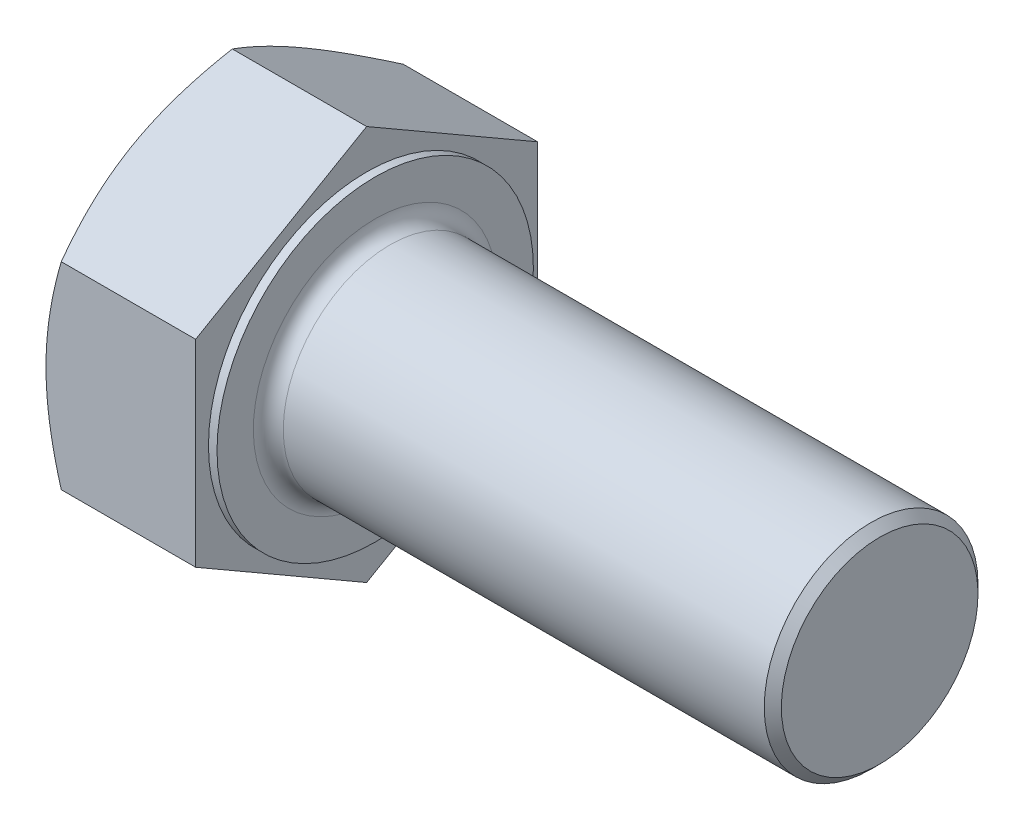
ISO-10303-21;
HEADER;
FILE_DESCRIPTION(('STEP AP214'),'2;1');
FILE_NAME('part.step','',(''),(''),'','','');
FILE_SCHEMA(('AUTOMOTIVE_DESIGN { 1 0 10303 214 1 1 1 1 }'));
ENDSEC;
DATA;
#1=APPLICATION_CONTEXT('core data for automotive mechanical design processes');
#2=APPLICATION_PROTOCOL_DEFINITION('international standard','automotive_design',2000,#1);
#3=PRODUCT_CONTEXT('',#1,'mechanical');
#4=PRODUCT('Part','Part','',(#3));
#5=PRODUCT_RELATED_PRODUCT_CATEGORY('part','',(#4));
#6=PRODUCT_DEFINITION_FORMATION('','',#4);
#7=PRODUCT_DEFINITION_CONTEXT('part definition',#1,'design');
#8=PRODUCT_DEFINITION('design','',#6,#7);
#9=PRODUCT_DEFINITION_SHAPE('','',#8);
#10=(LENGTH_UNIT() NAMED_UNIT(*) SI_UNIT(.MILLI.,.METRE.));
#11=(NAMED_UNIT(*) PLANE_ANGLE_UNIT() SI_UNIT($,.RADIAN.));
#12=(NAMED_UNIT(*) SI_UNIT($,.STERADIAN.) SOLID_ANGLE_UNIT());
#13=UNCERTAINTY_MEASURE_WITH_UNIT(LENGTH_MEASURE(1.E-05),#10,'distance_accuracy_value','');
#14=(GEOMETRIC_REPRESENTATION_CONTEXT(3) GLOBAL_UNCERTAINTY_ASSIGNED_CONTEXT((#13)) GLOBAL_UNIT_ASSIGNED_CONTEXT((#10,
#11,#12)) REPRESENTATION_CONTEXT('',''));
#15=CARTESIAN_POINT('',(0.,0.,0.));
#16=DIRECTION('',(0.,0.,1.));
#17=DIRECTION('',(1.,0.,0.));
#18=AXIS2_PLACEMENT_3D('',#15,#16,#17);
#19=CARTESIAN_POINT('',(-3.5,2.3094010767585,4.));
#20=DIRECTION('',(0.,-0.866025403784439,-0.5));
#21=DIRECTION('',(0.,0.5,-0.866025403784439));
#22=AXIS2_PLACEMENT_3D('',#19,#20,#21);
#23=PLANE('',#22);
#24=CARTESIAN_POINT('',(-3.14266774092523,2.30928560670467,4.0002));
#25=CARTESIAN_POINT('',(-3.20128212635172,2.41077174646171,3.82442084967677));
#26=CARTESIAN_POINT('',(-3.25458967853774,2.513133908835,3.64712438367362));
#27=CARTESIAN_POINT('',(-3.3476383292536,2.71963072479812,3.28946140682429));
#28=CARTESIAN_POINT('',(-3.3873465109703,2.82376904741904,3.10908854102985));
#29=CARTESIAN_POINT('',(-3.44915778471972,3.03075510011795,2.75057818129721));
#30=CARTESIAN_POINT('',(-3.47167226847711,3.13357098372492,2.57249584706486));
#31=CARTESIAN_POINT('',(-3.49854937685342,3.33968651028528,2.21549328283349));
#32=CARTESIAN_POINT('',(-3.50293425857306,3.44298540411434,2.0365743503559));
#33=CARTESIAN_POINT('',(-3.49380992706003,3.63600352522932,1.70225715780326));
#34=CARTESIAN_POINT('',(-3.48254104601201,3.72575165335065,1.54680884001293));
#35=CARTESIAN_POINT('',(-3.44682600920181,3.90466320392054,1.23692494436494));
#36=CARTESIAN_POINT('',(-3.42236765428847,3.99382600759478,1.08249043825587));
#37=CARTESIAN_POINT('',(-3.36122393508071,4.17310641015197,0.77196767222542));
#38=CARTESIAN_POINT('',(-3.32427939634514,4.26320131938131,0.615918711936896));
#39=CARTESIAN_POINT('',(-3.24042992745197,4.4420474282755,0.30614816459616));
#40=CARTESIAN_POINT('',(-3.19354469778726,4.53080091904966,0.15242260922622));
#41=CARTESIAN_POINT('',(-3.14266774092523,4.61891762357084,-0.000200000000000796));
#42=B_SPLINE_CURVE_WITH_KNOTS('',3,(#24,#25,#26,#27,#28,#29,#30,#31,#32,#33,#34,#35,#36,#37,#38,
#39,#40,#41),.UNSPECIFIED.,.F.,.F.,(4,2,2,2,2,2,2,2,4),(0.,0.634047835695967,1.26961969224544,
1.88946157213122,2.50854226669297,3.04757825393386,3.58711366126904,4.13861653143764,
4.68903648037743),.UNSPECIFIED.);
#43=CARTESIAN_POINT('',(-3.14273441009184,2.3094010767585,4.));
#44=VERTEX_POINT('',#43);
#45=CARTESIAN_POINT('',(-3.5,3.46410161513776,2.));
#46=VERTEX_POINT('',#45);
#47=EDGE_CURVE('E113',#44,#46,#42,.T.);
#48=ORIENTED_EDGE('',*,*,#47,.F.);
#49=DIRECTION('',(1.,0.,0.));
#50=VECTOR('',#49,1.);
#51=CARTESIAN_POINT('',(-3.5,2.3094010767585,4.));
#52=LINE('',#51,#50);
#53=CARTESIAN_POINT('',(0.,2.3094010767585,4.));
#54=VERTEX_POINT('',#53);
#55=EDGE_CURVE('E59',#44,#54,#52,.T.);
#56=ORIENTED_EDGE('',*,*,#55,.T.);
#57=DIRECTION('',(0.,0.5,-0.866025403784439));
#58=VECTOR('',#57,1.);
#59=CARTESIAN_POINT('',(0.,2.3094010767585,4.));
#60=LINE('',#59,#58);
#61=CARTESIAN_POINT('',(0.,4.61880215351701,0.));
#62=VERTEX_POINT('',#61);
#63=EDGE_CURVE('E123',#54,#62,#60,.T.);
#64=ORIENTED_EDGE('',*,*,#63,.T.);
#65=DIRECTION('',(1.,0.,0.));
#66=VECTOR('',#65,1.);
#67=CARTESIAN_POINT('',(-3.5,4.61880215351701,0.));
#68=LINE('',#67,#66);
#69=CARTESIAN_POINT('',(-3.14273441009184,4.61880215351701,0.));
#70=VERTEX_POINT('',#69);
#71=EDGE_CURVE('E142',#70,#62,#68,.T.);
#72=ORIENTED_EDGE('',*,*,#71,.F.);
#73=EDGE_CURVE('E122',#46,#70,#42,.T.);
#74=ORIENTED_EDGE('',*,*,#73,.F.);
#75=EDGE_LOOP('',(#48,#56,#64,#72,#74));
#76=FACE_BOUND('',#75,.T.);
#77=ADVANCED_FACE('F36',(#76),#23,.F.);
#78=CARTESIAN_POINT('',(-3.5,4.61880215351701,0.));
#79=DIRECTION('',(0.,-0.866025403784439,0.5));
#80=DIRECTION('',(0.,-0.5,-0.866025403784439));
#81=AXIS2_PLACEMENT_3D('',#78,#79,#80);
#82=PLANE('',#81);
#83=CARTESIAN_POINT('',(-3.14266774092523,4.61891762357084,0.000200000000000082));
#84=CARTESIAN_POINT('',(-3.20128212635172,4.5174314838138,-0.175579150323228));
#85=CARTESIAN_POINT('',(-3.25458967853774,4.41506932144051,-0.352875616326381));
#86=CARTESIAN_POINT('',(-3.3476383292536,4.20857250547739,-0.710538593175707));
#87=CARTESIAN_POINT('',(-3.3873465109703,4.10443418285647,-0.890911458970152));
#88=CARTESIAN_POINT('',(-3.44915778471972,3.89744813015756,-1.24942181870279));
#89=CARTESIAN_POINT('',(-3.47167226847711,3.79463224655059,-1.42750415293514));
#90=CARTESIAN_POINT('',(-3.49854937685342,3.58851671999023,-1.78450671716651));
#91=CARTESIAN_POINT('',(-3.50293425857306,3.48521782616117,-1.9634256496441));
#92=CARTESIAN_POINT('',(-3.49380992706003,3.29219970504619,-2.29774284219674));
#93=CARTESIAN_POINT('',(-3.48254104601201,3.20245157692486,-2.45319115998707));
#94=CARTESIAN_POINT('',(-3.44682600920181,3.02354002635496,-2.76307505563506));
#95=CARTESIAN_POINT('',(-3.42236765428847,2.93437722268072,-2.91750956174413));
#96=CARTESIAN_POINT('',(-3.36122393508071,2.75509682012354,-3.22803232777458));
#97=CARTESIAN_POINT('',(-3.32427939634514,2.6650019108942,-3.3840812880631));
#98=CARTESIAN_POINT('',(-3.24042992745197,2.48615580200001,-3.69385183540384));
#99=CARTESIAN_POINT('',(-3.19354469778726,2.39740231122585,-3.84757739077378));
#100=CARTESIAN_POINT('',(-3.14266774092523,2.30928560670467,-4.0002));
#101=B_SPLINE_CURVE_WITH_KNOTS('',3,(#83,#84,#85,#86,#87,#88,#89,#90,#91,#92,#93,#94,#95,#96,
#97,#98,#99,#100),.UNSPECIFIED.,.F.,.F.,(4,2,2,2,2,2,2,2,4),(0.,0.634047835695967,
1.26961969224544,1.88946157213122,2.50854226669297,3.04757825393386,3.58711366126904,
4.13861653143764,4.68903648037743),.UNSPECIFIED.);
#102=CARTESIAN_POINT('',(-3.5,3.46410161513776,-2.));
#103=VERTEX_POINT('',#102);
#104=EDGE_CURVE('E194',#70,#103,#101,.T.);
#105=ORIENTED_EDGE('',*,*,#104,.F.);
#106=ORIENTED_EDGE('',*,*,#71,.T.);
#107=DIRECTION('',(0.,-0.5,-0.866025403784439));
#108=VECTOR('',#107,1.);
#109=CARTESIAN_POINT('',(0.,4.61880215351701,0.));
#110=LINE('',#109,#108);
#111=CARTESIAN_POINT('',(0.,2.3094010767585,-4.));
#112=VERTEX_POINT('',#111);
#113=EDGE_CURVE('E270',#62,#112,#110,.T.);
#114=ORIENTED_EDGE('',*,*,#113,.T.);
#115=DIRECTION('',(1.,0.,0.));
#116=VECTOR('',#115,1.);
#117=CARTESIAN_POINT('',(-3.5,2.3094010767585,-4.));
#118=LINE('',#117,#116);
#119=CARTESIAN_POINT('',(-3.14273441009184,2.3094010767585,-4.));
#120=VERTEX_POINT('',#119);
#121=EDGE_CURVE('E140',#120,#112,#118,.T.);
#122=ORIENTED_EDGE('',*,*,#121,.F.);
#123=EDGE_CURVE('E195',#103,#120,#101,.T.);
#124=ORIENTED_EDGE('',*,*,#123,.F.);
#125=EDGE_LOOP('',(#105,#106,#114,#122,#124));
#126=FACE_BOUND('',#125,.T.);
#127=ADVANCED_FACE('F174',(#126),#82,.F.);
#128=CARTESIAN_POINT('',(-3.5,2.3094010767585,-4.));
#129=DIRECTION('',(0.,0.,1.));
#130=DIRECTION('',(1.,0.,0.));
#131=AXIS2_PLACEMENT_3D('',#128,#129,#130);
#132=PLANE('',#131);
#133=CARTESIAN_POINT('',(-1.58589317875936,-6.12487198995892,-4.));
#134=CARTESIAN_POINT('',(-1.6707637292331,-5.94924937038676,-4.));
#135=CARTESIAN_POINT('',(-1.7547905961926,-5.77321152095286,-4.));
#136=CARTESIAN_POINT('',(-1.92067485320284,-5.42008084777954,-4.));
#137=CARTESIAN_POINT('',(-2.00253186763277,-5.24298784779927,-4.));
#138=CARTESIAN_POINT('',(-2.16402553694145,-4.88656571686333,-4.));
#139=CARTESIAN_POINT('',(-2.24364680493697,-4.70722958889362,-4.));
#140=CARTESIAN_POINT('',(-2.39946941457971,-4.34708334747263,-4.));
#141=CARTESIAN_POINT('',(-2.47567093449198,-4.16627331143537,-4.));
#142=CARTESIAN_POINT('',(-2.62464934960564,-3.80064706744977,-4.));
#143=CARTESIAN_POINT('',(-2.69737271578416,-3.6158089282277,-4.));
#144=CARTESIAN_POINT('',(-2.83712376904058,-3.24395246794968,-4.));
#145=CARTESIAN_POINT('',(-2.9041508224335,-3.05693390695801,-4.));
#146=CARTESIAN_POINT('',(-3.03070825156912,-2.6808031825377,-4.));
#147=CARTESIAN_POINT('',(-3.09025456521617,-2.49169643712848,-4.));
#148=CARTESIAN_POINT('',(-3.1999166434555,-2.11079454635851,-4.));
#149=CARTESIAN_POINT('',(-3.25003539032325,-1.91900027185748,-4.));
#150=CARTESIAN_POINT('',(-3.33840920504596,-1.532592326982,-4.));
#151=CARTESIAN_POINT('',(-3.37666111404346,-1.33797792031649,-4.));
#152=CARTESIAN_POINT('',(-3.43872576407766,-0.94640272587255,-4.));
#153=CARTESIAN_POINT('',(-3.4625384923483,-0.74944193601977,-4.));
#154=CARTESIAN_POINT('',(-3.49361818685057,-0.355451989627939,-4.));
#155=CARTESIAN_POINT('',(-3.50098990076104,-0.158431311094008,-4.));
#156=CARTESIAN_POINT('',(-3.49879593362521,0.235472085607472,-4.));
#157=CARTESIAN_POINT('',(-3.48923464918465,0.432354826312208,-4.));
#158=CARTESIAN_POINT('',(-3.45912126538641,0.768560635225519,-4.));
#159=CARTESIAN_POINT('',(-3.44249070395609,0.908254618381822,-4.));
#160=CARTESIAN_POINT('',(-3.40178658965331,1.18656349063497,-4.));
#161=CARTESIAN_POINT('',(-3.37771186294155,1.32517820601013,-4.));
#162=CARTESIAN_POINT('',(-3.29558492904977,1.7392904545297,-4.));
#163=CARTESIAN_POINT('',(-3.22765111357485,2.01284690528723,-4.));
#164=CARTESIAN_POINT('',(-3.11048364068279,2.42218253014524,-4.));
#165=CARTESIAN_POINT('',(-3.06828605818836,2.56009536361539,-4.));
#166=CARTESIAN_POINT('',(-2.97971541977224,2.83448159101404,-4.));
#167=CARTESIAN_POINT('',(-2.93334524381308,2.97095590623558,-4.));
#168=CARTESIAN_POINT('',(-2.83739430081971,3.24189440516341,-4.));
#169=CARTESIAN_POINT('',(-2.7878330742465,3.37636557946839,-4.));
#170=CARTESIAN_POINT('',(-2.6858016462093,3.64426461152914,-4.));
#171=CARTESIAN_POINT('',(-2.63333026903663,3.77769202239388,-4.));
#172=CARTESIAN_POINT('',(-2.5796909934582,3.91063698986685,-4.));
#173=B_SPLINE_CURVE_WITH_KNOTS('',3,(#133,#134,#135,#136,#137,#138,#139,#140,#141,#142,#143,
#144,#145,#146,#147,#148,#149,#150,#151,#152,#153,#154,#155,#156,#157,#158,#159,#160,#161,#162,
#163,#164,#165,#166,#167,#168,#169,#170,#171,#172),.UNSPECIFIED.,.F.,.F.,(4,2,2,2,2,2,2,2,2,2,2,
2,2,2,2,2,2,2,2,4),(0.,0.585171792532272,1.17044423059927,1.7590659464599,2.34765694284827,
2.94347400997483,3.53935727210689,4.133948646976,4.72835161391471,5.32291267067845,
5.91747425310813,6.50823685854037,7.09884609659886,7.52068140825521,7.9425832713084,
8.7870149135983,9.21965281897689,9.65199437116298,10.0819024146297,10.5119854255247),.UNSPECIFIED.);
#174=CARTESIAN_POINT('',(-3.5,0.,-4.));
#175=VERTEX_POINT('',#174);
#176=EDGE_CURVE('E238',#120,#175,#173,.F.);
#177=ORIENTED_EDGE('',*,*,#176,.F.);
#178=ORIENTED_EDGE('',*,*,#121,.T.);
#179=DIRECTION('',(0.,-1.,0.));
#180=VECTOR('',#179,1.);
#181=CARTESIAN_POINT('',(0.,2.3094010767585,-4.));
#182=LINE('',#181,#180);
#183=CARTESIAN_POINT('',(0.,-2.3094010767585,-4.));
#184=VERTEX_POINT('',#183);
#185=EDGE_CURVE('E271',#112,#184,#182,.T.);
#186=ORIENTED_EDGE('',*,*,#185,.T.);
#187=DIRECTION('',(1.,0.,0.));
#188=VECTOR('',#187,1.);
#189=CARTESIAN_POINT('',(-3.5,-2.3094010767585,-4.));
#190=LINE('',#189,#188);
#191=CARTESIAN_POINT('',(-3.14273441009184,-2.3094010767585,-4.00000000000001));
#192=VERTEX_POINT('',#191);
#193=EDGE_CURVE('E138',#192,#184,#190,.T.);
#194=ORIENTED_EDGE('',*,*,#193,.F.);
#195=EDGE_CURVE('E233',#175,#192,#173,.F.);
#196=ORIENTED_EDGE('',*,*,#195,.F.);
#197=EDGE_LOOP('',(#177,#178,#186,#194,#196));
#198=FACE_BOUND('',#197,.T.);
#199=ADVANCED_FACE('F179',(#198),#132,.F.);
#200=CARTESIAN_POINT('',(-3.5,-2.3094010767585,-4.));
#201=DIRECTION('',(0.,0.866025403784439,0.5));
#202=DIRECTION('',(0.,-0.5,0.866025403784439));
#203=AXIS2_PLACEMENT_3D('',#200,#201,#202);
#204=PLANE('',#203);
#205=CARTESIAN_POINT('',(-3.14266774092523,-2.30928560670467,-4.0002));
#206=CARTESIAN_POINT('',(-3.20128212635172,-2.41077174646171,-3.82442084967677));
#207=CARTESIAN_POINT('',(-3.25458967853774,-2.513133908835,-3.64712438367362));
#208=CARTESIAN_POINT('',(-3.3476383292536,-2.71963072479812,-3.28946140682429));
#209=CARTESIAN_POINT('',(-3.3873465109703,-2.82376904741904,-3.10908854102985));
#210=CARTESIAN_POINT('',(-3.44915778471972,-3.03075510011795,-2.75057818129721));
#211=CARTESIAN_POINT('',(-3.47167226847711,-3.13357098372492,-2.57249584706486));
#212=CARTESIAN_POINT('',(-3.49854937685342,-3.33968651028528,-2.21549328283349));
#213=CARTESIAN_POINT('',(-3.50293425857306,-3.44298540411434,-2.0365743503559));
#214=CARTESIAN_POINT('',(-3.49380992706003,-3.63600352522932,-1.70225715780327));
#215=CARTESIAN_POINT('',(-3.48254104601201,-3.72575165335065,-1.54680884001293));
#216=CARTESIAN_POINT('',(-3.44682600920181,-3.90466320392054,-1.23692494436494));
#217=CARTESIAN_POINT('',(-3.42236765428847,-3.99382600759478,-1.08249043825587));
#218=CARTESIAN_POINT('',(-3.36122393508071,-4.17310641015197,-0.771967672225422));
#219=CARTESIAN_POINT('',(-3.32427939634514,-4.26320131938131,-0.615918711936898));
#220=CARTESIAN_POINT('',(-3.24042992745197,-4.4420474282755,-0.306148164596162));
#221=CARTESIAN_POINT('',(-3.19354469778726,-4.53080091904966,-0.152422609226222));
#222=CARTESIAN_POINT('',(-3.14266774092523,-4.61891762357084,0.000199999999998485));
#223=B_SPLINE_CURVE_WITH_KNOTS('',3,(#205,#206,#207,#208,#209,#210,#211,#212,#213,#214,#215,
#216,#217,#218,#219,#220,#221,#222),.UNSPECIFIED.,.F.,.F.,(4,2,2,2,2,2,2,2,4),(0.,
0.634047835695966,1.26961969224543,1.88946157213122,2.50854226669297,3.04757825393386,
3.58711366126903,4.13861653143764,4.68903648037743),.UNSPECIFIED.);
#224=CARTESIAN_POINT('',(-3.5,-3.46410161513776,-2.));
#225=VERTEX_POINT('',#224);
#226=EDGE_CURVE('E239',#192,#225,#223,.T.);
#227=ORIENTED_EDGE('',*,*,#226,.F.);
#228=ORIENTED_EDGE('',*,*,#193,.T.);
#229=DIRECTION('',(0.,-0.5,0.866025403784439));
#230=VECTOR('',#229,1.);
#231=CARTESIAN_POINT('',(0.,-2.3094010767585,-4.));
#232=LINE('',#231,#230);
#233=CARTESIAN_POINT('',(0.,-4.61880215351701,0.));
#234=VERTEX_POINT('',#233);
#235=EDGE_CURVE('E274',#184,#234,#232,.T.);
#236=ORIENTED_EDGE('',*,*,#235,.T.);
#237=DIRECTION('',(1.,0.,0.));
#238=VECTOR('',#237,1.);
#239=CARTESIAN_POINT('',(-3.5,-4.61880215351701,0.));
#240=LINE('',#239,#238);
#241=CARTESIAN_POINT('',(-3.14273441009184,-4.61880215351701,0.));
#242=VERTEX_POINT('',#241);
#243=EDGE_CURVE('E131',#242,#234,#240,.T.);
#244=ORIENTED_EDGE('',*,*,#243,.F.);
#245=EDGE_CURVE('E227',#225,#242,#223,.T.);
#246=ORIENTED_EDGE('',*,*,#245,.F.);
#247=EDGE_LOOP('',(#227,#228,#236,#244,#246));
#248=FACE_BOUND('',#247,.T.);
#249=ADVANCED_FACE('F242',(#248),#204,.F.);
#250=CARTESIAN_POINT('',(-3.5,-4.61880215351701,0.));
#251=DIRECTION('',(0.,0.866025403784439,-0.5));
#252=DIRECTION('',(0.,0.5,0.866025403784439));
#253=AXIS2_PLACEMENT_3D('',#250,#251,#252);
#254=PLANE('',#253);
#255=CARTESIAN_POINT('',(-3.14266774092523,-4.61891762357084,-0.000200000000001406));
#256=CARTESIAN_POINT('',(-3.20128212635172,-4.5174314838138,0.175579150323227));
#257=CARTESIAN_POINT('',(-3.25458967853774,-4.41506932144052,0.35287561632638));
#258=CARTESIAN_POINT('',(-3.3476383292536,-4.20857250547739,0.710538593175706));
#259=CARTESIAN_POINT('',(-3.3873465109703,-4.10443418285647,0.890911458970151));
#260=CARTESIAN_POINT('',(-3.44915778471972,-3.89744813015756,1.24942181870279));
#261=CARTESIAN_POINT('',(-3.47167226847711,-3.79463224655059,1.42750415293514));
#262=CARTESIAN_POINT('',(-3.49854937685342,-3.58851671999023,1.78450671716651));
#263=CARTESIAN_POINT('',(-3.50293425857306,-3.48521782616117,1.9634256496441));
#264=CARTESIAN_POINT('',(-3.49380992706003,-3.29219970504619,2.29774284219673));
#265=CARTESIAN_POINT('',(-3.48254104601201,-3.20245157692486,2.45319115998707));
#266=CARTESIAN_POINT('',(-3.44682600920181,-3.02354002635497,2.76307505563506));
#267=CARTESIAN_POINT('',(-3.42236765428847,-2.93437722268073,2.91750956174413));
#268=CARTESIAN_POINT('',(-3.36122393508071,-2.75509682012354,3.22803232777458));
#269=CARTESIAN_POINT('',(-3.32427939634514,-2.6650019108942,3.3840812880631));
#270=CARTESIAN_POINT('',(-3.24042992745197,-2.48615580200001,3.69385183540384));
#271=CARTESIAN_POINT('',(-3.19354469778726,-2.39740231122585,3.84757739077378));
#272=CARTESIAN_POINT('',(-3.14266774092523,-2.30928560670467,4.0002));
#273=B_SPLINE_CURVE_WITH_KNOTS('',3,(#255,#256,#257,#258,#259,#260,#261,#262,#263,#264,#265,
#266,#267,#268,#269,#270,#271,#272),.UNSPECIFIED.,.F.,.F.,(4,2,2,2,2,2,2,2,4),(0.,
0.634047835695967,1.26961969224544,1.88946157213122,2.50854226669297,3.04757825393386,
3.58711366126904,4.13861653143764,4.68903648037743),.UNSPECIFIED.);
#274=CARTESIAN_POINT('',(-3.5,-3.46410161513776,2.));
#275=VERTEX_POINT('',#274);
#276=EDGE_CURVE('E317',#242,#275,#273,.T.);
#277=ORIENTED_EDGE('',*,*,#276,.F.);
#278=ORIENTED_EDGE('',*,*,#243,.T.);
#279=DIRECTION('',(0.,0.5,0.866025403784439));
#280=VECTOR('',#279,1.);
#281=CARTESIAN_POINT('',(0.,-4.61880215351701,0.));
#282=LINE('',#281,#280);
#283=CARTESIAN_POINT('',(0.,-2.3094010767585,4.));
#284=VERTEX_POINT('',#283);
#285=EDGE_CURVE('E133',#234,#284,#282,.T.);
#286=ORIENTED_EDGE('',*,*,#285,.T.);
#287=DIRECTION('',(1.,0.,0.));
#288=VECTOR('',#287,1.);
#289=CARTESIAN_POINT('',(-3.5,-2.3094010767585,4.));
#290=LINE('',#289,#288);
#291=CARTESIAN_POINT('',(-3.14273441009184,-2.30940107675851,4.));
#292=VERTEX_POINT('',#291);
#293=EDGE_CURVE('E129',#292,#284,#290,.T.);
#294=ORIENTED_EDGE('',*,*,#293,.F.);
#295=EDGE_CURVE('E219',#275,#292,#273,.T.);
#296=ORIENTED_EDGE('',*,*,#295,.F.);
#297=EDGE_LOOP('',(#277,#278,#286,#294,#296));
#298=FACE_BOUND('',#297,.T.);
#299=ADVANCED_FACE('F246',(#298),#254,.F.);
#300=CARTESIAN_POINT('',(-3.5,-2.3094010767585,4.));
#301=DIRECTION('',(0.,0.,-1.));
#302=DIRECTION('',(-1.,0.,0.));
#303=AXIS2_PLACEMENT_3D('',#300,#301,#302);
#304=PLANE('',#303);
#305=CARTESIAN_POINT('',(-1.58589317875936,-6.12487198995892,4.));
#306=CARTESIAN_POINT('',(-1.6707637292331,-5.94924937038676,4.));
#307=CARTESIAN_POINT('',(-1.7547905961926,-5.77321152095286,4.));
#308=CARTESIAN_POINT('',(-1.92067485320284,-5.42008084777954,4.));
#309=CARTESIAN_POINT('',(-2.00253186763277,-5.24298784779927,4.));
#310=CARTESIAN_POINT('',(-2.16402553694145,-4.88656571686333,4.));
#311=CARTESIAN_POINT('',(-2.24364680493697,-4.70722958889362,4.));
#312=CARTESIAN_POINT('',(-2.39946941457971,-4.34708334747263,4.));
#313=CARTESIAN_POINT('',(-2.47567093449198,-4.16627331143537,4.));
#314=CARTESIAN_POINT('',(-2.62464934960564,-3.80064706744977,4.));
#315=CARTESIAN_POINT('',(-2.69737271578416,-3.6158089282277,4.));
#316=CARTESIAN_POINT('',(-2.83712376904058,-3.24395246794968,4.));
#317=CARTESIAN_POINT('',(-2.9041508224335,-3.05693390695801,4.));
#318=CARTESIAN_POINT('',(-3.03070825156912,-2.6808031825377,4.));
#319=CARTESIAN_POINT('',(-3.09025456521617,-2.49169643712848,4.));
#320=CARTESIAN_POINT('',(-3.1999166434555,-2.11079454635851,4.));
#321=CARTESIAN_POINT('',(-3.25003539032325,-1.91900027185748,4.));
#322=CARTESIAN_POINT('',(-3.33840920504596,-1.532592326982,4.));
#323=CARTESIAN_POINT('',(-3.37666111404346,-1.33797792031649,4.));
#324=CARTESIAN_POINT('',(-3.43872576407766,-0.94640272587255,4.));
#325=CARTESIAN_POINT('',(-3.4625384923483,-0.74944193601977,4.));
#326=CARTESIAN_POINT('',(-3.49361818685057,-0.355451989627939,4.));
#327=CARTESIAN_POINT('',(-3.50098990076104,-0.158431311094008,4.));
#328=CARTESIAN_POINT('',(-3.49879593362521,0.235472085607472,4.));
#329=CARTESIAN_POINT('',(-3.48923464918465,0.432354826312208,4.));
#330=CARTESIAN_POINT('',(-3.45912126538641,0.768560635225519,4.));
#331=CARTESIAN_POINT('',(-3.44249070395609,0.908254618381822,4.));
#332=CARTESIAN_POINT('',(-3.40178658965331,1.18656349063498,4.));
#333=CARTESIAN_POINT('',(-3.37771186294155,1.32517820601014,4.));
#334=CARTESIAN_POINT('',(-3.29558492904977,1.7392904545297,4.));
#335=CARTESIAN_POINT('',(-3.22765111357485,2.01284690528723,4.));
#336=CARTESIAN_POINT('',(-3.11048364068279,2.42218253014524,4.));
#337=CARTESIAN_POINT('',(-3.06828605818836,2.56009536361539,4.));
#338=CARTESIAN_POINT('',(-2.97971541977224,2.83448159101404,4.));
#339=CARTESIAN_POINT('',(-2.93334524381309,2.97095590623558,4.));
#340=CARTESIAN_POINT('',(-2.83739430081971,3.24189440516341,4.));
#341=CARTESIAN_POINT('',(-2.7878330742465,3.37636557946839,4.));
#342=CARTESIAN_POINT('',(-2.68580164620929,3.64426461152914,4.));
#343=CARTESIAN_POINT('',(-2.63333026903663,3.77769202239388,4.));
#344=CARTESIAN_POINT('',(-2.5796909934582,3.91063698986685,4.));
#345=B_SPLINE_CURVE_WITH_KNOTS('',3,(#305,#306,#307,#308,#309,#310,#311,#312,#313,#314,#315,
#316,#317,#318,#319,#320,#321,#322,#323,#324,#325,#326,#327,#328,#329,#330,#331,#332,#333,#334,
#335,#336,#337,#338,#339,#340,#341,#342,#343,#344),.UNSPECIFIED.,.F.,.F.,(4,2,2,2,2,2,2,2,2,2,2,
2,2,2,2,2,2,2,2,4),(0.,0.585171792532272,1.17044423059927,1.7590659464599,2.34765694284827,
2.94347400997483,3.53935727210689,4.133948646976,4.72835161391471,5.32291267067845,
5.91747425310813,6.50823685854037,7.09884609659886,7.52068140825521,7.9425832713084,
8.7870149135983,9.21965281897689,9.65199437116298,10.0819024146297,10.5119854255247),.UNSPECIFIED.);
#346=CARTESIAN_POINT('',(-3.5,0.,4.));
#347=VERTEX_POINT('',#346);
#348=EDGE_CURVE('E118',#292,#347,#345,.T.);
#349=ORIENTED_EDGE('',*,*,#348,.F.);
#350=ORIENTED_EDGE('',*,*,#293,.T.);
#351=DIRECTION('',(0.,1.,0.));
#352=VECTOR('',#351,1.);
#353=CARTESIAN_POINT('',(0.,-2.3094010767585,4.));
#354=LINE('',#353,#352);
#355=EDGE_CURVE('E127',#284,#54,#354,.T.);
#356=ORIENTED_EDGE('',*,*,#355,.T.);
#357=ORIENTED_EDGE('',*,*,#55,.F.);
#358=EDGE_CURVE('E111',#347,#44,#345,.T.);
#359=ORIENTED_EDGE('',*,*,#358,.F.);
#360=EDGE_LOOP('',(#349,#350,#356,#357,#359));
#361=FACE_BOUND('',#360,.T.);
#362=ADVANCED_FACE('F125',(#361),#304,.F.);
#363=CARTESIAN_POINT('',(0.2,3.7,0.));
#364=DIRECTION('',(1.,0.,0.));
#365=DIRECTION('',(0.,1.,0.));
#366=AXIS2_PLACEMENT_3D('',#363,#364,#365);
#367=PLANE('',#366);
#368=CARTESIAN_POINT('',(0.199999999999999,0.,0.));
#369=DIRECTION('',(1.,0.,0.));
#370=DIRECTION('',(0.,1.,0.));
#371=AXIS2_PLACEMENT_3D('',#368,#369,#370);
#372=CIRCLE('',#371,2.85);
#373=CARTESIAN_POINT('',(0.2,2.85,0.));
#374=VERTEX_POINT('',#373);
#375=EDGE_CURVE('E11',#374,#374,#372,.F.);
#376=ORIENTED_EDGE('',*,*,#375,.T.);
#377=EDGE_LOOP('',(#376));
#378=FACE_BOUND('',#377,.T.);
#379=CARTESIAN_POINT('',(0.200000000000001,0.,0.));
#380=DIRECTION('',(1.,0.,0.));
#381=DIRECTION('',(0.,1.,0.));
#382=AXIS2_PLACEMENT_3D('',#379,#380,#381);
#383=CIRCLE('',#382,3.7);
#384=CARTESIAN_POINT('',(0.200000000000001,3.7,0.));
#385=VERTEX_POINT('',#384);
#386=EDGE_CURVE('E147',#385,#385,#383,.T.);
#387=ORIENTED_EDGE('',*,*,#386,.T.);
#388=EDGE_LOOP('',(#387));
#389=FACE_BOUND('',#388,.T.);
#390=ADVANCED_FACE('F253',(#378,#389),#367,.T.);
#391=CARTESIAN_POINT('',(12.,0.,0.));
#392=DIRECTION('',(1.,0.,0.));
#393=DIRECTION('',(0.,1.,0.));
#394=AXIS2_PLACEMENT_3D('',#391,#392,#393);
#395=CYLINDRICAL_SURFACE('',#394,3.7);
#396=CARTESIAN_POINT('',(0.,0.,0.));
#397=DIRECTION('',(-1.,0.,0.));
#398=DIRECTION('',(0.,0.,1.));
#399=AXIS2_PLACEMENT_3D('',#396,#397,#398);
#400=CIRCLE('',#399,3.7);
#401=CARTESIAN_POINT('',(0.,0.,3.7));
#402=VERTEX_POINT('',#401);
#403=EDGE_CURVE('E144',#402,#402,#400,.F.);
#404=ORIENTED_EDGE('',*,*,#403,.T.);
#405=EDGE_LOOP('',(#404));
#406=FACE_BOUND('',#405,.T.);
#407=ORIENTED_EDGE('',*,*,#386,.F.);
#408=EDGE_LOOP('',(#407));
#409=FACE_BOUND('',#408,.T.);
#410=ADVANCED_FACE('F368',(#406,#409),#395,.T.);
#411=CARTESIAN_POINT('',(12.,2.5,0.));
#412=DIRECTION('',(1.,0.,0.));
#413=DIRECTION('',(0.,1.,0.));
#414=AXIS2_PLACEMENT_3D('',#411,#412,#413);
#415=PLANE('',#414);
#416=CARTESIAN_POINT('',(12.,0.,0.));
#417=DIRECTION('',(1.,0.,0.));
#418=DIRECTION('',(0.,1.,0.));
#419=AXIS2_PLACEMENT_3D('',#416,#417,#418);
#420=CIRCLE('',#419,2.3);
#421=CARTESIAN_POINT('',(12.,2.3,0.));
#422=VERTEX_POINT('',#421);
#423=EDGE_CURVE('E153',#422,#422,#420,.T.);
#424=ORIENTED_EDGE('',*,*,#423,.T.);
#425=EDGE_LOOP('',(#424));
#426=FACE_BOUND('',#425,.T.);
#427=ADVANCED_FACE('F263',(#426),#415,.T.);
#428=CARTESIAN_POINT('',(12.,0.,0.));
#429=DIRECTION('',(1.,0.,0.));
#430=DIRECTION('',(0.,1.,0.));
#431=AXIS2_PLACEMENT_3D('',#428,#429,#430);
#432=CYLINDRICAL_SURFACE('',#431,2.5);
#433=CARTESIAN_POINT('',(0.55,0.,0.));
#434=DIRECTION('',(1.,0.,0.));
#435=DIRECTION('',(0.,1.,0.));
#436=AXIS2_PLACEMENT_3D('',#433,#434,#435);
#437=CIRCLE('',#436,2.5);
#438=CARTESIAN_POINT('',(0.550000000000001,2.5,0.));
#439=VERTEX_POINT('',#438);
#440=EDGE_CURVE('E44',#439,#439,#437,.T.);
#441=ORIENTED_EDGE('',*,*,#440,.T.);
#442=EDGE_LOOP('',(#441));
#443=FACE_BOUND('',#442,.T.);
#444=CARTESIAN_POINT('',(11.8,0.,0.));
#445=DIRECTION('',(1.,0.,0.));
#446=DIRECTION('',(0.,1.,0.));
#447=AXIS2_PLACEMENT_3D('',#444,#445,#446);
#448=CIRCLE('',#447,2.5);
#449=CARTESIAN_POINT('',(11.8,2.5,0.));
#450=VERTEX_POINT('',#449);
#451=EDGE_CURVE('E156',#450,#450,#448,.F.);
#452=ORIENTED_EDGE('',*,*,#451,.T.);
#453=EDGE_LOOP('',(#452));
#454=FACE_BOUND('',#453,.T.);
#455=ADVANCED_FACE('F161',(#443,#454),#432,.T.);
#456=CARTESIAN_POINT('',(0.,0.,0.));
#457=DIRECTION('',(-1.,0.,0.));
#458=DIRECTION('',(0.,0.,1.));
#459=AXIS2_PLACEMENT_3D('',#456,#457,#458);
#460=PLANE('',#459);
#461=ORIENTED_EDGE('',*,*,#403,.F.);
#462=EDGE_LOOP('',(#461));
#463=FACE_BOUND('',#462,.T.);
#464=ORIENTED_EDGE('',*,*,#63,.F.);
#465=ORIENTED_EDGE('',*,*,#355,.F.);
#466=ORIENTED_EDGE('',*,*,#285,.F.);
#467=ORIENTED_EDGE('',*,*,#235,.F.);
#468=ORIENTED_EDGE('',*,*,#185,.F.);
#469=ORIENTED_EDGE('',*,*,#113,.F.);
#470=EDGE_LOOP('',(#464,#465,#466,#467,#468,#469));
#471=FACE_BOUND('',#470,.T.);
#472=ADVANCED_FACE('F254',(#463,#471),#460,.F.);
#473=CARTESIAN_POINT('',(-3.5,0.,0.));
#474=DIRECTION('',(1.,0.,0.));
#475=DIRECTION('',(0.,0.,-1.));
#476=AXIS2_PLACEMENT_3D('',#473,#474,#475);
#477=CONICAL_SURFACE('',#476,4.,1.0471975511966);
#478=ORIENTED_EDGE('',*,*,#295,.T.);
#479=ORIENTED_EDGE('',*,*,#348,.T.);
#480=CARTESIAN_POINT('',(-3.5,0.,0.));
#481=DIRECTION('',(-1.,0.,0.));
#482=DIRECTION('',(0.,0.,1.));
#483=AXIS2_PLACEMENT_3D('',#480,#481,#482);
#484=CIRCLE('',#483,4.);
#485=EDGE_CURVE('E51',#275,#347,#484,.T.);
#486=ORIENTED_EDGE('',*,*,#485,.F.);
#487=EDGE_LOOP('',(#478,#479,#486));
#488=FACE_BOUND('',#487,.T.);
#489=ADVANCED_FACE('F206',(#488),#477,.T.);
#490=ORIENTED_EDGE('',*,*,#245,.T.);
#491=ORIENTED_EDGE('',*,*,#276,.T.);
#492=EDGE_CURVE('E151',#225,#275,#484,.T.);
#493=ORIENTED_EDGE('',*,*,#492,.F.);
#494=EDGE_LOOP('',(#490,#491,#493));
#495=FACE_BOUND('',#494,.T.);
#496=ADVANCED_FACE('F261',(#495),#477,.T.);
#497=ORIENTED_EDGE('',*,*,#195,.T.);
#498=ORIENTED_EDGE('',*,*,#226,.T.);
#499=EDGE_CURVE('E300',#175,#225,#484,.T.);
#500=ORIENTED_EDGE('',*,*,#499,.F.);
#501=EDGE_LOOP('',(#497,#498,#500));
#502=FACE_BOUND('',#501,.T.);
#503=ADVANCED_FACE('F301',(#502),#477,.T.);
#504=ORIENTED_EDGE('',*,*,#123,.T.);
#505=ORIENTED_EDGE('',*,*,#176,.T.);
#506=EDGE_CURVE('E296',#103,#175,#484,.T.);
#507=ORIENTED_EDGE('',*,*,#506,.F.);
#508=EDGE_LOOP('',(#504,#505,#507));
#509=FACE_BOUND('',#508,.T.);
#510=ADVANCED_FACE('F294',(#509),#477,.T.);
#511=ORIENTED_EDGE('',*,*,#73,.T.);
#512=ORIENTED_EDGE('',*,*,#104,.T.);
#513=EDGE_CURVE('E152',#46,#103,#484,.T.);
#514=ORIENTED_EDGE('',*,*,#513,.F.);
#515=EDGE_LOOP('',(#511,#512,#514));
#516=FACE_BOUND('',#515,.T.);
#517=ADVANCED_FACE('F205',(#516),#477,.T.);
#518=ORIENTED_EDGE('',*,*,#47,.T.);
#519=CARTESIAN_POINT('',(-3.5,0.,0.));
#520=DIRECTION('',(-1.,0.,0.));
#521=DIRECTION('',(0.,0.,1.));
#522=AXIS2_PLACEMENT_3D('',#519,#520,#521);
#523=CIRCLE('',#522,4.);
#524=EDGE_CURVE('E115',#347,#46,#523,.T.);
#525=ORIENTED_EDGE('',*,*,#524,.F.);
#526=ORIENTED_EDGE('',*,*,#358,.T.);
#527=EDGE_LOOP('',(#518,#525,#526));
#528=FACE_BOUND('',#527,.T.);
#529=ADVANCED_FACE('F112',(#528),#477,.T.);
#530=CARTESIAN_POINT('',(-3.5,0.,0.));
#531=DIRECTION('',(-1.,0.,0.));
#532=DIRECTION('',(0.,0.,1.));
#533=AXIS2_PLACEMENT_3D('',#530,#531,#532);
#534=PLANE('',#533);
#535=ORIENTED_EDGE('',*,*,#485,.T.);
#536=ORIENTED_EDGE('',*,*,#524,.T.);
#537=ORIENTED_EDGE('',*,*,#513,.T.);
#538=ORIENTED_EDGE('',*,*,#506,.T.);
#539=ORIENTED_EDGE('',*,*,#499,.T.);
#540=ORIENTED_EDGE('',*,*,#492,.T.);
#541=EDGE_LOOP('',(#535,#536,#537,#538,#539,#540));
#542=FACE_BOUND('',#541,.T.);
#543=ADVANCED_FACE('F170',(#542),#534,.T.);
#544=CARTESIAN_POINT('',(12.,0.,0.));
#545=DIRECTION('',(-1.,0.,0.));
#546=DIRECTION('',(0.,-1.,0.));
#547=AXIS2_PLACEMENT_3D('',#544,#545,#546);
#548=CONICAL_SURFACE('',#547,2.3,0.785398163397446);
#549=ORIENTED_EDGE('',*,*,#451,.F.);
#550=EDGE_LOOP('',(#549));
#551=FACE_BOUND('',#550,.T.);
#552=ORIENTED_EDGE('',*,*,#423,.F.);
#553=EDGE_LOOP('',(#552));
#554=FACE_BOUND('',#553,.T.);
#555=ADVANCED_FACE('F165',(#551,#554),#548,.T.);
#556=CARTESIAN_POINT('',(0.55,0.,0.));
#557=DIRECTION('',(1.,0.,0.));
#558=DIRECTION('',(0.,1.,0.));
#559=AXIS2_PLACEMENT_3D('',#556,#557,#558);
#560=TOROIDAL_SURFACE('',#559,2.85,0.35);
#561=ORIENTED_EDGE('',*,*,#375,.F.);
#562=EDGE_LOOP('',(#561));
#563=FACE_BOUND('',#562,.T.);
#564=ORIENTED_EDGE('',*,*,#440,.F.);
#565=EDGE_LOOP('',(#564));
#566=FACE_BOUND('',#565,.T.);
#567=ADVANCED_FACE('F38',(#563,#566),#560,.F.);
#568=CLOSED_SHELL('',(#77,#127,#199,#249,#299,#362,#390,#410,#427,#455,#472,#489,#496,#503,#510,
#517,#529,#543,#555,#567));
#569=MANIFOLD_SOLID_BREP('B2',#568);
#570=ADVANCED_BREP_SHAPE_REPRESENTATION('',(#18,#569),#14);
#571=SHAPE_DEFINITION_REPRESENTATION(#9,#570);
ENDSEC;
END-ISO-10303-21;
